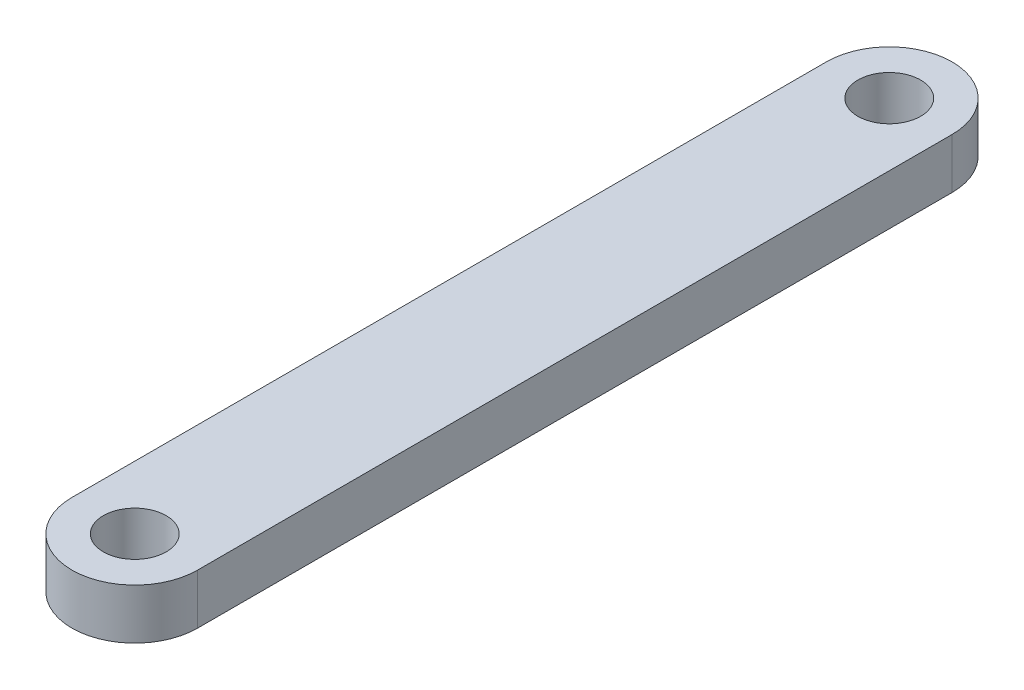
ISO-10303-21;
HEADER;
FILE_DESCRIPTION(('STEP AP214'),'2;1');
FILE_NAME('part.step','',(''),(''),'','','');
FILE_SCHEMA(('AUTOMOTIVE_DESIGN { 1 0 10303 214 1 1 1 1 }'));
ENDSEC;
DATA;
#1=APPLICATION_CONTEXT('core data for automotive mechanical design processes');
#2=APPLICATION_PROTOCOL_DEFINITION('international standard','automotive_design',2000,#1);
#3=PRODUCT_CONTEXT('',#1,'mechanical');
#4=PRODUCT('Part','Part','',(#3));
#5=PRODUCT_RELATED_PRODUCT_CATEGORY('part','',(#4));
#6=PRODUCT_DEFINITION_FORMATION('','',#4);
#7=PRODUCT_DEFINITION_CONTEXT('part definition',#1,'design');
#8=PRODUCT_DEFINITION('design','',#6,#7);
#9=PRODUCT_DEFINITION_SHAPE('','',#8);
#10=(LENGTH_UNIT() NAMED_UNIT(*) SI_UNIT(.MILLI.,.METRE.));
#11=(NAMED_UNIT(*) PLANE_ANGLE_UNIT() SI_UNIT($,.RADIAN.));
#12=(NAMED_UNIT(*) SI_UNIT($,.STERADIAN.) SOLID_ANGLE_UNIT());
#13=UNCERTAINTY_MEASURE_WITH_UNIT(LENGTH_MEASURE(1.E-05),#10,'distance_accuracy_value','');
#14=(GEOMETRIC_REPRESENTATION_CONTEXT(3) GLOBAL_UNCERTAINTY_ASSIGNED_CONTEXT((#13)) GLOBAL_UNIT_ASSIGNED_CONTEXT((#10,
#11,#12)) REPRESENTATION_CONTEXT('',''));
#15=CARTESIAN_POINT('',(0.,0.,0.));
#16=DIRECTION('',(0.,0.,1.));
#17=DIRECTION('',(1.,0.,0.));
#18=AXIS2_PLACEMENT_3D('',#15,#16,#17);
#19=CARTESIAN_POINT('',(0.,2.54,-38.1));
#20=DIRECTION('',(0.,1.,0.));
#21=DIRECTION('',(0.,0.,1.));
#22=AXIS2_PLACEMENT_3D('',#19,#20,#21);
#23=PLANE('',#22);
#24=CARTESIAN_POINT('',(0.,2.54,0.));
#25=DIRECTION('',(0.,1.,0.));
#26=DIRECTION('',(0.,0.,1.));
#27=AXIS2_PLACEMENT_3D('',#24,#25,#26);
#28=CIRCLE('',#27,1.5875);
#29=CARTESIAN_POINT('',(0.,2.54,1.5875));
#30=VERTEX_POINT('',#29);
#31=EDGE_CURVE('E116',#30,#30,#28,.T.);
#32=ORIENTED_EDGE('',*,*,#31,.F.);
#33=EDGE_LOOP('',(#32));
#34=FACE_BOUND('',#33,.T.);
#35=CARTESIAN_POINT('',(0.,2.54,-38.1));
#36=DIRECTION('',(0.,1.,0.));
#37=DIRECTION('',(0.,0.,1.));
#38=AXIS2_PLACEMENT_3D('',#35,#36,#37);
#39=CIRCLE('',#38,3.17500000000003);
#40=CARTESIAN_POINT('',(3.175,2.54,-38.0999996018093));
#41=VERTEX_POINT('',#40);
#42=CARTESIAN_POINT('',(-3.175,2.54,-38.0999996018093));
#43=VERTEX_POINT('',#42);
#44=EDGE_CURVE('E96',#41,#43,#39,.T.);
#45=ORIENTED_EDGE('',*,*,#44,.T.);
#46=DIRECTION('',(0.,0.,1.));
#47=VECTOR('',#46,1.);
#48=CARTESIAN_POINT('',(-3.175,2.54,-38.0999996018093));
#49=LINE('',#48,#47);
#50=CARTESIAN_POINT('',(-3.175,2.54,-3.98185645913984E-07));
#51=VERTEX_POINT('',#50);
#52=EDGE_CURVE('E91',#43,#51,#49,.T.);
#53=ORIENTED_EDGE('',*,*,#52,.T.);
#54=CARTESIAN_POINT('',(0.,2.54,0.));
#55=DIRECTION('',(0.,1.,0.));
#56=DIRECTION('',(0.,0.,1.));
#57=AXIS2_PLACEMENT_3D('',#54,#55,#56);
#58=CIRCLE('',#57,3.17500000000003);
#59=CARTESIAN_POINT('',(3.175,2.54,-3.98185645905536E-07));
#60=VERTEX_POINT('',#59);
#61=EDGE_CURVE('E94',#51,#60,#58,.T.);
#62=ORIENTED_EDGE('',*,*,#61,.T.);
#63=DIRECTION('',(0.,0.,-1.));
#64=VECTOR('',#63,1.);
#65=CARTESIAN_POINT('',(3.175,2.54,-38.0999996018093));
#66=LINE('',#65,#64);
#67=EDGE_CURVE('E61',#60,#41,#66,.T.);
#68=ORIENTED_EDGE('',*,*,#67,.T.);
#69=EDGE_LOOP('',(#45,#53,#62,#68));
#70=FACE_BOUND('',#69,.T.);
#71=CARTESIAN_POINT('',(0.,2.54,-38.1));
#72=DIRECTION('',(0.,1.,0.));
#73=DIRECTION('',(0.,0.,1.));
#74=AXIS2_PLACEMENT_3D('',#71,#72,#73);
#75=CIRCLE('',#74,1.5875);
#76=CARTESIAN_POINT('',(0.,2.54,-36.5125));
#77=VERTEX_POINT('',#76);
#78=EDGE_CURVE('E138',#77,#77,#75,.T.);
#79=ORIENTED_EDGE('',*,*,#78,.F.);
#80=EDGE_LOOP('',(#79));
#81=FACE_BOUND('',#80,.T.);
#82=ADVANCED_FACE('F43',(#34,#70,#81),#23,.T.);
#83=CARTESIAN_POINT('',(0.,0.,-38.1));
#84=DIRECTION('',(0.,1.,0.));
#85=DIRECTION('',(0.,0.,1.));
#86=AXIS2_PLACEMENT_3D('',#83,#84,#85);
#87=PLANE('',#86);
#88=CARTESIAN_POINT('',(0.,0.,-38.1));
#89=DIRECTION('',(0.,1.,0.));
#90=DIRECTION('',(0.,0.,1.));
#91=AXIS2_PLACEMENT_3D('',#88,#89,#90);
#92=CIRCLE('',#91,3.17500000000003);
#93=CARTESIAN_POINT('',(3.175,0.,-38.0999996018093));
#94=VERTEX_POINT('',#93);
#95=CARTESIAN_POINT('',(-3.175,0.,-38.0999996018093));
#96=VERTEX_POINT('',#95);
#97=EDGE_CURVE('E112',#94,#96,#92,.T.);
#98=ORIENTED_EDGE('',*,*,#97,.F.);
#99=DIRECTION('',(0.,0.,-1.));
#100=VECTOR('',#99,1.);
#101=CARTESIAN_POINT('',(3.175,0.,-38.0999996018093));
#102=LINE('',#101,#100);
#103=CARTESIAN_POINT('',(3.175,0.,-3.98185645905536E-07));
#104=VERTEX_POINT('',#103);
#105=EDGE_CURVE('E84',#104,#94,#102,.T.);
#106=ORIENTED_EDGE('',*,*,#105,.F.);
#107=CARTESIAN_POINT('',(0.,0.,0.));
#108=DIRECTION('',(0.,1.,0.));
#109=DIRECTION('',(0.,0.,1.));
#110=AXIS2_PLACEMENT_3D('',#107,#108,#109);
#111=CIRCLE('',#110,3.17500000000003);
#112=CARTESIAN_POINT('',(-3.175,0.,-3.98185645913984E-07));
#113=VERTEX_POINT('',#112);
#114=EDGE_CURVE('E78',#113,#104,#111,.T.);
#115=ORIENTED_EDGE('',*,*,#114,.F.);
#116=DIRECTION('',(0.,0.,1.));
#117=VECTOR('',#116,1.);
#118=CARTESIAN_POINT('',(-3.175,0.,-38.0999996018093));
#119=LINE('',#118,#117);
#120=EDGE_CURVE('E101',#96,#113,#119,.T.);
#121=ORIENTED_EDGE('',*,*,#120,.F.);
#122=EDGE_LOOP('',(#98,#106,#115,#121));
#123=FACE_BOUND('',#122,.T.);
#124=CARTESIAN_POINT('',(0.,0.,0.));
#125=DIRECTION('',(0.,1.,0.));
#126=DIRECTION('',(0.,0.,1.));
#127=AXIS2_PLACEMENT_3D('',#124,#125,#126);
#128=CIRCLE('',#127,1.5875);
#129=CARTESIAN_POINT('',(0.,0.,1.5875));
#130=VERTEX_POINT('',#129);
#131=EDGE_CURVE('E134',#130,#130,#128,.T.);
#132=ORIENTED_EDGE('',*,*,#131,.T.);
#133=EDGE_LOOP('',(#132));
#134=FACE_BOUND('',#133,.T.);
#135=CARTESIAN_POINT('',(0.,0.,-38.1));
#136=DIRECTION('',(0.,1.,0.));
#137=DIRECTION('',(0.,0.,1.));
#138=AXIS2_PLACEMENT_3D('',#135,#136,#137);
#139=CIRCLE('',#138,1.5875);
#140=CARTESIAN_POINT('',(0.,0.,-36.5125));
#141=VERTEX_POINT('',#140);
#142=EDGE_CURVE('E142',#141,#141,#139,.T.);
#143=ORIENTED_EDGE('',*,*,#142,.T.);
#144=EDGE_LOOP('',(#143));
#145=FACE_BOUND('',#144,.T.);
#146=ADVANCED_FACE('F129',(#123,#134,#145),#87,.F.);
#147=CARTESIAN_POINT('',(0.,2.54,-38.1));
#148=DIRECTION('',(0.,-1.,0.));
#149=DIRECTION('',(0.,0.,-1.));
#150=AXIS2_PLACEMENT_3D('',#147,#148,#149);
#151=CYLINDRICAL_SURFACE('',#150,3.17500000000003);
#152=ORIENTED_EDGE('',*,*,#97,.T.);
#153=DIRECTION('',(0.,-1.,0.));
#154=VECTOR('',#153,1.);
#155=CARTESIAN_POINT('',(-3.175,2.54,-38.0999996018093));
#156=LINE('',#155,#154);
#157=EDGE_CURVE('E11',#43,#96,#156,.T.);
#158=ORIENTED_EDGE('',*,*,#157,.F.);
#159=ORIENTED_EDGE('',*,*,#44,.F.);
#160=DIRECTION('',(0.,-1.,0.));
#161=VECTOR('',#160,1.);
#162=CARTESIAN_POINT('',(3.175,2.54,-38.0999996018093));
#163=LINE('',#162,#161);
#164=EDGE_CURVE('E108',#41,#94,#163,.T.);
#165=ORIENTED_EDGE('',*,*,#164,.T.);
#166=EDGE_LOOP('',(#152,#158,#159,#165));
#167=FACE_BOUND('',#166,.T.);
#168=ADVANCED_FACE('F45',(#167),#151,.T.);
#169=CARTESIAN_POINT('',(-3.175,2.54,-38.0999996018093));
#170=DIRECTION('',(1.,0.,0.));
#171=DIRECTION('',(0.,0.,-1.));
#172=AXIS2_PLACEMENT_3D('',#169,#170,#171);
#173=PLANE('',#172);
#174=ORIENTED_EDGE('',*,*,#120,.T.);
#175=DIRECTION('',(0.,-1.,0.));
#176=VECTOR('',#175,1.);
#177=CARTESIAN_POINT('',(-3.175,2.54,-3.98185645913984E-07));
#178=LINE('',#177,#176);
#179=EDGE_CURVE('E53',#51,#113,#178,.T.);
#180=ORIENTED_EDGE('',*,*,#179,.F.);
#181=ORIENTED_EDGE('',*,*,#52,.F.);
#182=ORIENTED_EDGE('',*,*,#157,.T.);
#183=EDGE_LOOP('',(#174,#180,#181,#182));
#184=FACE_BOUND('',#183,.T.);
#185=ADVANCED_FACE('F100',(#184),#173,.F.);
#186=CARTESIAN_POINT('',(0.,2.54,0.));
#187=DIRECTION('',(0.,-1.,0.));
#188=DIRECTION('',(0.,0.,-1.));
#189=AXIS2_PLACEMENT_3D('',#186,#187,#188);
#190=CYLINDRICAL_SURFACE('',#189,3.17500000000003);
#191=ORIENTED_EDGE('',*,*,#114,.T.);
#192=DIRECTION('',(0.,-1.,0.));
#193=VECTOR('',#192,1.);
#194=CARTESIAN_POINT('',(3.175,2.54,-3.98185645905536E-07));
#195=LINE('',#194,#193);
#196=EDGE_CURVE('E103',#60,#104,#195,.T.);
#197=ORIENTED_EDGE('',*,*,#196,.F.);
#198=ORIENTED_EDGE('',*,*,#61,.F.);
#199=ORIENTED_EDGE('',*,*,#179,.T.);
#200=EDGE_LOOP('',(#191,#197,#198,#199));
#201=FACE_BOUND('',#200,.T.);
#202=ADVANCED_FACE('F104',(#201),#190,.T.);
#203=CARTESIAN_POINT('',(3.175,2.54,-38.0999996018093));
#204=DIRECTION('',(-1.,0.,0.));
#205=DIRECTION('',(0.,0.,1.));
#206=AXIS2_PLACEMENT_3D('',#203,#204,#205);
#207=PLANE('',#206);
#208=ORIENTED_EDGE('',*,*,#105,.T.);
#209=ORIENTED_EDGE('',*,*,#164,.F.);
#210=ORIENTED_EDGE('',*,*,#67,.F.);
#211=ORIENTED_EDGE('',*,*,#196,.T.);
#212=EDGE_LOOP('',(#208,#209,#210,#211));
#213=FACE_BOUND('',#212,.T.);
#214=ADVANCED_FACE('F126',(#213),#207,.F.);
#215=CARTESIAN_POINT('',(0.,2.54,0.));
#216=DIRECTION('',(0.,-1.,0.));
#217=DIRECTION('',(0.,0.,-1.));
#218=AXIS2_PLACEMENT_3D('',#215,#216,#217);
#219=CYLINDRICAL_SURFACE('',#218,1.5875);
#220=ORIENTED_EDGE('',*,*,#31,.T.);
#221=EDGE_LOOP('',(#220));
#222=FACE_BOUND('',#221,.T.);
#223=ORIENTED_EDGE('',*,*,#131,.F.);
#224=EDGE_LOOP('',(#223));
#225=FACE_BOUND('',#224,.T.);
#226=ADVANCED_FACE('F161',(#222,#225),#219,.F.);
#227=CARTESIAN_POINT('',(0.,2.54,-38.1));
#228=DIRECTION('',(0.,-1.,0.));
#229=DIRECTION('',(0.,0.,-1.));
#230=AXIS2_PLACEMENT_3D('',#227,#228,#229);
#231=CYLINDRICAL_SURFACE('',#230,1.5875);
#232=ORIENTED_EDGE('',*,*,#78,.T.);
#233=EDGE_LOOP('',(#232));
#234=FACE_BOUND('',#233,.T.);
#235=ORIENTED_EDGE('',*,*,#142,.F.);
#236=EDGE_LOOP('',(#235));
#237=FACE_BOUND('',#236,.T.);
#238=ADVANCED_FACE('F150',(#234,#237),#231,.F.);
#239=CLOSED_SHELL('',(#82,#146,#168,#185,#202,#214,#226,#238));
#240=MANIFOLD_SOLID_BREP('B2',#239);
#241=ADVANCED_BREP_SHAPE_REPRESENTATION('',(#18,#240),#14);
#242=SHAPE_DEFINITION_REPRESENTATION(#9,#241);
ENDSEC;
END-ISO-10303-21;
